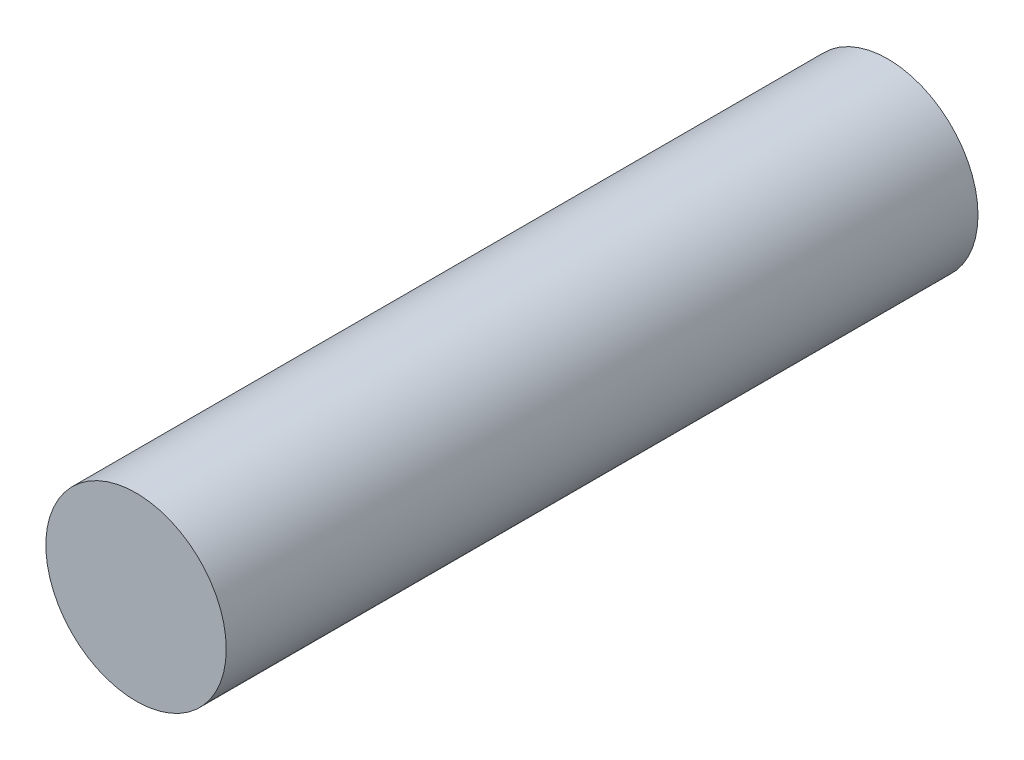
ISO-10303-21;
HEADER;
FILE_DESCRIPTION(('STEP AP214'),'2;1');
FILE_NAME('part.step','',(''),(''),'','','');
FILE_SCHEMA(('AUTOMOTIVE_DESIGN { 1 0 10303 214 1 1 1 1 }'));
ENDSEC;
DATA;
#1=APPLICATION_CONTEXT('core data for automotive mechanical design processes');
#2=APPLICATION_PROTOCOL_DEFINITION('international standard','automotive_design',2000,#1);
#3=PRODUCT_CONTEXT('',#1,'mechanical');
#4=PRODUCT('Part','Part','',(#3));
#5=PRODUCT_RELATED_PRODUCT_CATEGORY('part','',(#4));
#6=PRODUCT_DEFINITION_FORMATION('','',#4);
#7=PRODUCT_DEFINITION_CONTEXT('part definition',#1,'design');
#8=PRODUCT_DEFINITION('design','',#6,#7);
#9=PRODUCT_DEFINITION_SHAPE('','',#8);
#10=(LENGTH_UNIT() NAMED_UNIT(*) SI_UNIT(.MILLI.,.METRE.));
#11=(NAMED_UNIT(*) PLANE_ANGLE_UNIT() SI_UNIT($,.RADIAN.));
#12=(NAMED_UNIT(*) SI_UNIT($,.STERADIAN.) SOLID_ANGLE_UNIT());
#13=UNCERTAINTY_MEASURE_WITH_UNIT(LENGTH_MEASURE(1.E-05),#10,'distance_accuracy_value','');
#14=(GEOMETRIC_REPRESENTATION_CONTEXT(3) GLOBAL_UNCERTAINTY_ASSIGNED_CONTEXT((#13)) GLOBAL_UNIT_ASSIGNED_CONTEXT((#10,
#11,#12)) REPRESENTATION_CONTEXT('',''));
#15=CARTESIAN_POINT('',(0.,0.,0.));
#16=DIRECTION('',(0.,0.,1.));
#17=DIRECTION('',(1.,0.,0.));
#18=AXIS2_PLACEMENT_3D('',#15,#16,#17);
#19=CARTESIAN_POINT('',(0.,0.,10.));
#20=DIRECTION('',(0.,0.,-1.));
#21=DIRECTION('',(-1.,0.,0.));
#22=AXIS2_PLACEMENT_3D('',#19,#20,#21);
#23=CYLINDRICAL_SURFACE('',#22,2.4);
#24=CARTESIAN_POINT('',(0.,0.,10.));
#25=DIRECTION('',(0.,0.,1.));
#26=DIRECTION('',(1.,0.,0.));
#27=AXIS2_PLACEMENT_3D('',#24,#25,#26);
#28=CIRCLE('',#27,2.4);
#29=CARTESIAN_POINT('',(2.4,0.,10.));
#30=VERTEX_POINT('',#29);
#31=EDGE_CURVE('E11',#30,#30,#28,.T.);
#32=ORIENTED_EDGE('',*,*,#31,.F.);
#33=EDGE_LOOP('',(#32));
#34=FACE_BOUND('',#33,.T.);
#35=CARTESIAN_POINT('',(0.,0.,-10.));
#36=DIRECTION('',(0.,0.,1.));
#37=DIRECTION('',(1.,0.,0.));
#38=AXIS2_PLACEMENT_3D('',#35,#36,#37);
#39=CIRCLE('',#38,2.4);
#40=CARTESIAN_POINT('',(2.4,0.,-10.));
#41=VERTEX_POINT('',#40);
#42=EDGE_CURVE('E41',#41,#41,#39,.T.);
#43=ORIENTED_EDGE('',*,*,#42,.T.);
#44=EDGE_LOOP('',(#43));
#45=FACE_BOUND('',#44,.T.);
#46=ADVANCED_FACE('F38',(#34,#45),#23,.T.);
#47=CARTESIAN_POINT('',(0.,0.,10.));
#48=DIRECTION('',(0.,0.,1.));
#49=DIRECTION('',(1.,0.,0.));
#50=AXIS2_PLACEMENT_3D('',#47,#48,#49);
#51=PLANE('',#50);
#52=ORIENTED_EDGE('',*,*,#31,.T.);
#53=EDGE_LOOP('',(#52));
#54=FACE_BOUND('',#53,.T.);
#55=ADVANCED_FACE('F53',(#54),#51,.T.);
#56=CARTESIAN_POINT('',(0.,0.,-10.));
#57=DIRECTION('',(0.,0.,1.));
#58=DIRECTION('',(1.,0.,0.));
#59=AXIS2_PLACEMENT_3D('',#56,#57,#58);
#60=PLANE('',#59);
#61=ORIENTED_EDGE('',*,*,#42,.F.);
#62=EDGE_LOOP('',(#61));
#63=FACE_BOUND('',#62,.T.);
#64=ADVANCED_FACE('F51',(#63),#60,.F.);
#65=CLOSED_SHELL('',(#46,#55,#64));
#66=MANIFOLD_SOLID_BREP('B2',#65);
#67=ADVANCED_BREP_SHAPE_REPRESENTATION('',(#18,#66),#14);
#68=SHAPE_DEFINITION_REPRESENTATION(#9,#67);
ENDSEC;
END-ISO-10303-21;
